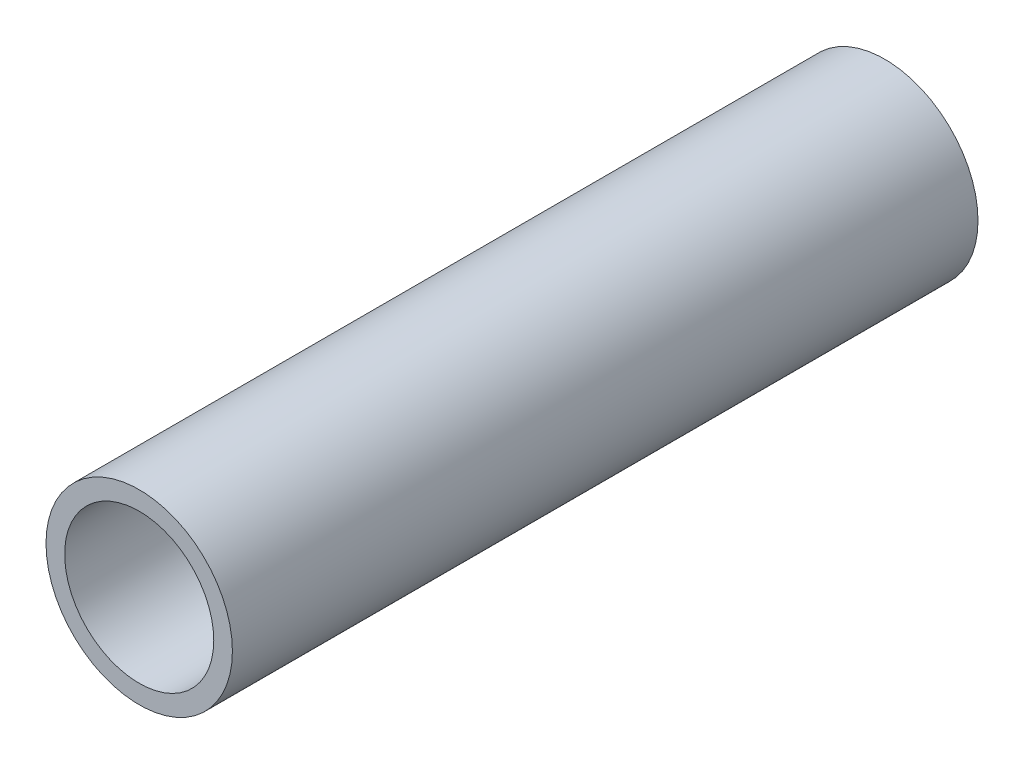
ISO-10303-21;
HEADER;
FILE_DESCRIPTION(('STEP AP214'),'2;1');
FILE_NAME('part.step','',(''),(''),'','','');
FILE_SCHEMA(('AUTOMOTIVE_DESIGN { 1 0 10303 214 1 1 1 1 }'));
ENDSEC;
DATA;
#1=APPLICATION_CONTEXT('core data for automotive mechanical design processes');
#2=APPLICATION_PROTOCOL_DEFINITION('international standard','automotive_design',2000,#1);
#3=PRODUCT_CONTEXT('',#1,'mechanical');
#4=PRODUCT('Part','Part','',(#3));
#5=PRODUCT_RELATED_PRODUCT_CATEGORY('part','',(#4));
#6=PRODUCT_DEFINITION_FORMATION('','',#4);
#7=PRODUCT_DEFINITION_CONTEXT('part definition',#1,'design');
#8=PRODUCT_DEFINITION('design','',#6,#7);
#9=PRODUCT_DEFINITION_SHAPE('','',#8);
#10=(LENGTH_UNIT() NAMED_UNIT(*) SI_UNIT(.MILLI.,.METRE.));
#11=(NAMED_UNIT(*) PLANE_ANGLE_UNIT() SI_UNIT($,.RADIAN.));
#12=(NAMED_UNIT(*) SI_UNIT($,.STERADIAN.) SOLID_ANGLE_UNIT());
#13=UNCERTAINTY_MEASURE_WITH_UNIT(LENGTH_MEASURE(1.E-05),#10,'distance_accuracy_value','');
#14=(GEOMETRIC_REPRESENTATION_CONTEXT(3) GLOBAL_UNCERTAINTY_ASSIGNED_CONTEXT((#13)) GLOBAL_UNIT_ASSIGNED_CONTEXT((#10,
#11,#12)) REPRESENTATION_CONTEXT('',''));
#15=CARTESIAN_POINT('',(0.,0.,0.));
#16=DIRECTION('',(0.,0.,1.));
#17=DIRECTION('',(1.,0.,0.));
#18=AXIS2_PLACEMENT_3D('',#15,#16,#17);
#19=CARTESIAN_POINT('',(0.,0.,40.));
#20=DIRECTION('',(0.,0.,1.));
#21=DIRECTION('',(1.,0.,0.));
#22=AXIS2_PLACEMENT_3D('',#19,#20,#21);
#23=PLANE('',#22);
#24=CARTESIAN_POINT('',(0.,0.,40.));
#25=DIRECTION('',(0.,0.,1.));
#26=DIRECTION('',(1.,0.,0.));
#27=AXIS2_PLACEMENT_3D('',#24,#25,#26);
#28=CIRCLE('',#27,5.);
#29=CARTESIAN_POINT('',(5.,0.,40.));
#30=VERTEX_POINT('',#29);
#31=EDGE_CURVE('E10',#30,#30,#28,.T.);
#32=ORIENTED_EDGE('',*,*,#31,.T.);
#33=EDGE_LOOP('',(#32));
#34=FACE_BOUND('',#33,.T.);
#35=CARTESIAN_POINT('',(0.,0.,40.));
#36=DIRECTION('',(0.,0.,1.));
#37=DIRECTION('',(1.,0.,0.));
#38=AXIS2_PLACEMENT_3D('',#35,#36,#37);
#39=CIRCLE('',#38,4.);
#40=CARTESIAN_POINT('',(4.,0.,40.));
#41=VERTEX_POINT('',#40);
#42=EDGE_CURVE('E48',#41,#41,#39,.T.);
#43=ORIENTED_EDGE('',*,*,#42,.F.);
#44=EDGE_LOOP('',(#43));
#45=FACE_BOUND('',#44,.T.);
#46=ADVANCED_FACE('F37',(#34,#45),#23,.T.);
#47=CARTESIAN_POINT('',(0.,0.,0.));
#48=DIRECTION('',(0.,0.,1.));
#49=DIRECTION('',(1.,0.,0.));
#50=AXIS2_PLACEMENT_3D('',#47,#48,#49);
#51=PLANE('',#50);
#52=CARTESIAN_POINT('',(0.,0.,0.));
#53=DIRECTION('',(0.,0.,1.));
#54=DIRECTION('',(1.,0.,0.));
#55=AXIS2_PLACEMENT_3D('',#52,#53,#54);
#56=CIRCLE('',#55,5.);
#57=CARTESIAN_POINT('',(5.,0.,0.));
#58=VERTEX_POINT('',#57);
#59=EDGE_CURVE('E41',#58,#58,#56,.T.);
#60=ORIENTED_EDGE('',*,*,#59,.F.);
#61=EDGE_LOOP('',(#60));
#62=FACE_BOUND('',#61,.T.);
#63=CARTESIAN_POINT('',(0.,0.,0.));
#64=DIRECTION('',(0.,0.,1.));
#65=DIRECTION('',(1.,0.,0.));
#66=AXIS2_PLACEMENT_3D('',#63,#64,#65);
#67=CIRCLE('',#66,4.);
#68=CARTESIAN_POINT('',(4.,0.,0.));
#69=VERTEX_POINT('',#68);
#70=EDGE_CURVE('E50',#69,#69,#67,.T.);
#71=ORIENTED_EDGE('',*,*,#70,.T.);
#72=EDGE_LOOP('',(#71));
#73=FACE_BOUND('',#72,.T.);
#74=ADVANCED_FACE('F60',(#62,#73),#51,.F.);
#75=CARTESIAN_POINT('',(0.,0.,40.));
#76=DIRECTION('',(0.,0.,-1.));
#77=DIRECTION('',(-1.,0.,0.));
#78=AXIS2_PLACEMENT_3D('',#75,#76,#77);
#79=CYLINDRICAL_SURFACE('',#78,5.);
#80=ORIENTED_EDGE('',*,*,#31,.F.);
#81=EDGE_LOOP('',(#80));
#82=FACE_BOUND('',#81,.T.);
#83=ORIENTED_EDGE('',*,*,#59,.T.);
#84=EDGE_LOOP('',(#83));
#85=FACE_BOUND('',#84,.T.);
#86=ADVANCED_FACE('F39',(#82,#85),#79,.T.);
#87=CARTESIAN_POINT('',(0.,0.,40.));
#88=DIRECTION('',(0.,0.,-1.));
#89=DIRECTION('',(-1.,0.,0.));
#90=AXIS2_PLACEMENT_3D('',#87,#88,#89);
#91=CYLINDRICAL_SURFACE('',#90,4.);
#92=ORIENTED_EDGE('',*,*,#42,.T.);
#93=EDGE_LOOP('',(#92));
#94=FACE_BOUND('',#93,.T.);
#95=ORIENTED_EDGE('',*,*,#70,.F.);
#96=EDGE_LOOP('',(#95));
#97=FACE_BOUND('',#96,.T.);
#98=ADVANCED_FACE('F56',(#94,#97),#91,.F.);
#99=CLOSED_SHELL('',(#46,#74,#86,#98));
#100=MANIFOLD_SOLID_BREP('B2',#99);
#101=ADVANCED_BREP_SHAPE_REPRESENTATION('',(#18,#100),#14);
#102=SHAPE_DEFINITION_REPRESENTATION(#9,#101);
ENDSEC;
END-ISO-10303-21;
